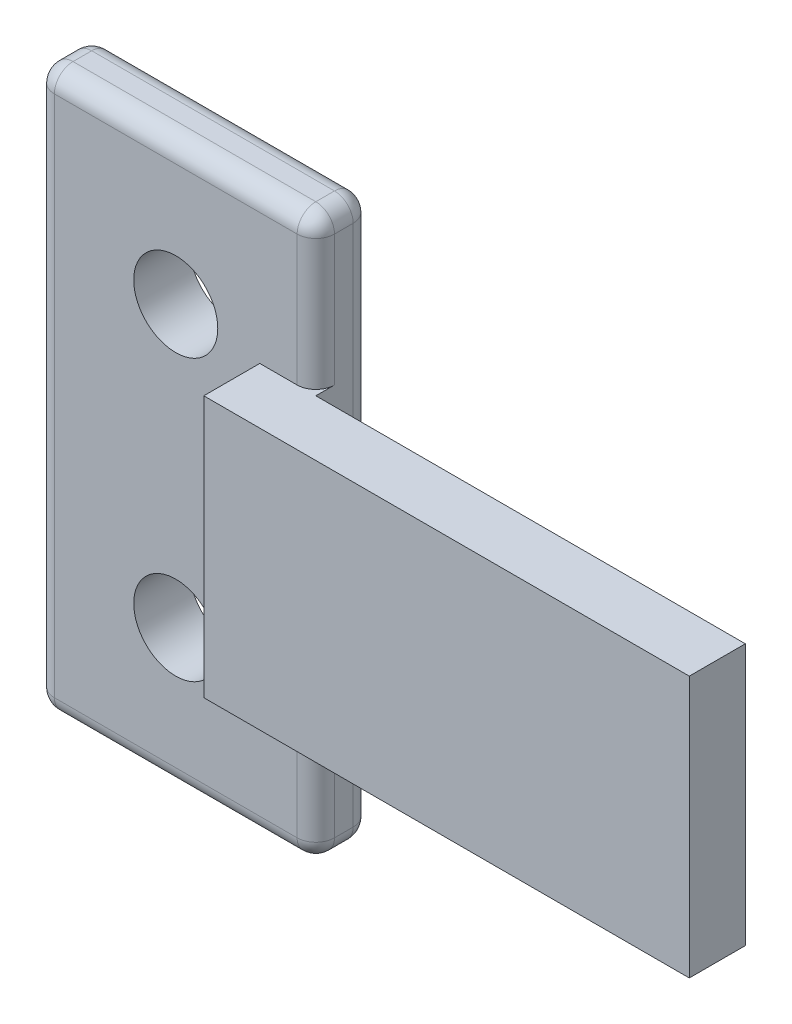
ISO-10303-21;
HEADER;
FILE_DESCRIPTION(('STEP AP214'),'2;1');
FILE_NAME('part.step','',(''),(''),'','','');
FILE_SCHEMA(('AUTOMOTIVE_DESIGN { 1 0 10303 214 1 1 1 1 }'));
ENDSEC;
DATA;
#1=APPLICATION_CONTEXT('core data for automotive mechanical design processes');
#2=APPLICATION_PROTOCOL_DEFINITION('international standard','automotive_design',2000,#1);
#3=PRODUCT_CONTEXT('',#1,'mechanical');
#4=PRODUCT('Part','Part','',(#3));
#5=PRODUCT_RELATED_PRODUCT_CATEGORY('part','',(#4));
#6=PRODUCT_DEFINITION_FORMATION('','',#4);
#7=PRODUCT_DEFINITION_CONTEXT('part definition',#1,'design');
#8=PRODUCT_DEFINITION('design','',#6,#7);
#9=PRODUCT_DEFINITION_SHAPE('','',#8);
#10=(LENGTH_UNIT() NAMED_UNIT(*) SI_UNIT(.MILLI.,.METRE.));
#11=(NAMED_UNIT(*) PLANE_ANGLE_UNIT() SI_UNIT($,.RADIAN.));
#12=(NAMED_UNIT(*) SI_UNIT($,.STERADIAN.) SOLID_ANGLE_UNIT());
#13=UNCERTAINTY_MEASURE_WITH_UNIT(LENGTH_MEASURE(1.E-05),#10,'distance_accuracy_value','');
#14=(GEOMETRIC_REPRESENTATION_CONTEXT(3) GLOBAL_UNCERTAINTY_ASSIGNED_CONTEXT((#13)) GLOBAL_UNIT_ASSIGNED_CONTEXT((#10,
#11,#12)) REPRESENTATION_CONTEXT('',''));
#15=CARTESIAN_POINT('',(0.,0.,0.));
#16=DIRECTION('',(0.,0.,1.));
#17=DIRECTION('',(1.,0.,0.));
#18=AXIS2_PLACEMENT_3D('',#15,#16,#17);
#19=CARTESIAN_POINT('',(0.,0.,3.));
#20=DIRECTION('',(0.,0.,1.));
#21=DIRECTION('',(1.,0.,0.));
#22=AXIS2_PLACEMENT_3D('',#19,#20,#21);
#23=PLANE('',#22);
#24=DIRECTION('',(1.,0.,0.));
#25=VECTOR('',#24,1.);
#26=CARTESIAN_POINT('',(12.,-7.99999999999995,3.));
#27=LINE('',#26,#25);
#28=CARTESIAN_POINT('',(12.,-7.99999999999995,3.));
#29=VERTEX_POINT('',#28);
#30=CARTESIAN_POINT('',(14.,-7.99999999999999,3.));
#31=VERTEX_POINT('',#30);
#32=EDGE_CURVE('E181',#29,#31,#27,.T.);
#33=ORIENTED_EDGE('',*,*,#32,.T.);
#34=DIRECTION('',(0.,1.,0.));
#35=VECTOR('',#34,1.);
#36=CARTESIAN_POINT('',(14.,0.,2.99999999999984));
#37=LINE('',#36,#35);
#38=CARTESIAN_POINT('',(13.9999999999999,-0.99999999999989,2.99999999999984));
#39=VERTEX_POINT('',#38);
#40=EDGE_CURVE('E244',#31,#39,#37,.T.);
#41=ORIENTED_EDGE('',*,*,#40,.T.);
#42=DIRECTION('',(-1.,0.,0.));
#43=VECTOR('',#42,1.);
#44=CARTESIAN_POINT('',(0.,-0.999999999999987,3.));
#45=LINE('',#44,#43);
#46=CARTESIAN_POINT('',(1.,-0.999999999999987,3.));
#47=VERTEX_POINT('',#46);
#48=EDGE_CURVE('E242',#39,#47,#45,.T.);
#49=ORIENTED_EDGE('',*,*,#48,.T.);
#50=DIRECTION('',(0.,-1.,0.));
#51=VECTOR('',#50,1.);
#52=CARTESIAN_POINT('',(0.999999999999945,-29.9999999999999,2.99999999999984));
#53=LINE('',#52,#51);
#54=CARTESIAN_POINT('',(1.,-29.,2.99999999999984));
#55=VERTEX_POINT('',#54);
#56=EDGE_CURVE('E240',#47,#55,#53,.T.);
#57=ORIENTED_EDGE('',*,*,#56,.T.);
#58=DIRECTION('',(1.,0.,0.));
#59=VECTOR('',#58,1.);
#60=CARTESIAN_POINT('',(15.,-28.9999999999999,2.99999999999998));
#61=LINE('',#60,#59);
#62=CARTESIAN_POINT('',(14.,-29.,2.99999999999998));
#63=VERTEX_POINT('',#62);
#64=EDGE_CURVE('E237',#55,#63,#61,.T.);
#65=ORIENTED_EDGE('',*,*,#64,.T.);
#66=DIRECTION('',(0.,1.,0.));
#67=VECTOR('',#66,1.);
#68=CARTESIAN_POINT('',(14.,-22.,3.));
#69=LINE('',#68,#67);
#70=CARTESIAN_POINT('',(14.,-22.,3.));
#71=VERTEX_POINT('',#70);
#72=EDGE_CURVE('E233',#63,#71,#69,.T.);
#73=ORIENTED_EDGE('',*,*,#72,.T.);
#74=DIRECTION('',(1.,0.,0.));
#75=VECTOR('',#74,1.);
#76=CARTESIAN_POINT('',(12.,-22.,3.));
#77=LINE('',#76,#75);
#78=CARTESIAN_POINT('',(12.,-22.,3.));
#79=VERTEX_POINT('',#78);
#80=EDGE_CURVE('E220',#79,#71,#77,.T.);
#81=ORIENTED_EDGE('',*,*,#80,.F.);
#82=DIRECTION('',(0.,-1.,0.));
#83=VECTOR('',#82,1.);
#84=CARTESIAN_POINT('',(12.,-22.,3.));
#85=LINE('',#84,#83);
#86=EDGE_CURVE('E209',#29,#79,#85,.T.);
#87=ORIENTED_EDGE('',*,*,#86,.F.);
#88=EDGE_LOOP('',(#33,#41,#49,#57,#65,#73,#81,#87));
#89=FACE_BOUND('',#88,.T.);
#90=CARTESIAN_POINT('',(7.50000000000001,-7.49999999999998,3.));
#91=DIRECTION('',(0.,0.,1.));
#92=DIRECTION('',(1.,0.,0.));
#93=AXIS2_PLACEMENT_3D('',#90,#91,#92);
#94=CIRCLE('',#93,2.24999999999999);
#95=CARTESIAN_POINT('',(9.74999999999999,-7.49999999999998,3.));
#96=VERTEX_POINT('',#95);
#97=EDGE_CURVE('E230',#96,#96,#94,.T.);
#98=ORIENTED_EDGE('',*,*,#97,.F.);
#99=EDGE_LOOP('',(#98));
#100=FACE_BOUND('',#99,.T.);
#101=CARTESIAN_POINT('',(7.49999999999995,-22.4999999999999,3.));
#102=DIRECTION('',(0.,0.,1.));
#103=DIRECTION('',(1.,0.,0.));
#104=AXIS2_PLACEMENT_3D('',#101,#102,#103);
#105=CIRCLE('',#104,2.24999999999999);
#106=CARTESIAN_POINT('',(9.74999999999994,-22.4999999999999,3.));
#107=VERTEX_POINT('',#106);
#108=EDGE_CURVE('E224',#107,#107,#105,.T.);
#109=ORIENTED_EDGE('',*,*,#108,.F.);
#110=EDGE_LOOP('',(#109));
#111=FACE_BOUND('',#110,.T.);
#112=ADVANCED_FACE('F36',(#89,#100,#111),#23,.T.);
#113=CARTESIAN_POINT('',(0.,0.,0.));
#114=DIRECTION('',(0.,0.,1.));
#115=DIRECTION('',(1.,0.,0.));
#116=AXIS2_PLACEMENT_3D('',#113,#114,#115);
#117=PLANE('',#116);
#118=DIRECTION('',(1.,0.,0.));
#119=VECTOR('',#118,1.);
#120=CARTESIAN_POINT('',(0.,-28.9999999999999,-1.66533453693773E-13));
#121=LINE('',#120,#119);
#122=CARTESIAN_POINT('',(14.,-29.,0.));
#123=VERTEX_POINT('',#122);
#124=CARTESIAN_POINT('',(1.,-29.,-1.66533453693773E-13));
#125=VERTEX_POINT('',#124);
#126=EDGE_CURVE('E273',#123,#125,#121,.F.);
#127=ORIENTED_EDGE('',*,*,#126,.T.);
#128=DIRECTION('',(0.,-1.,0.));
#129=VECTOR('',#128,1.);
#130=CARTESIAN_POINT('',(1.,0.,0.));
#131=LINE('',#130,#129);
#132=CARTESIAN_POINT('',(1.,-0.999999999999987,0.));
#133=VERTEX_POINT('',#132);
#134=EDGE_CURVE('E276',#125,#133,#131,.F.);
#135=ORIENTED_EDGE('',*,*,#134,.T.);
#136=DIRECTION('',(-1.,0.,0.));
#137=VECTOR('',#136,1.);
#138=CARTESIAN_POINT('',(0.,-0.999999999999945,0.));
#139=LINE('',#138,#137);
#140=CARTESIAN_POINT('',(13.9999999999999,-0.99999999999989,-1.66533453693773E-13));
#141=VERTEX_POINT('',#140);
#142=EDGE_CURVE('E271',#133,#141,#139,.F.);
#143=ORIENTED_EDGE('',*,*,#142,.T.);
#144=DIRECTION('',(0.,1.,0.));
#145=VECTOR('',#144,1.);
#146=CARTESIAN_POINT('',(14.,0.,-1.66533453693773E-13));
#147=LINE('',#146,#145);
#148=EDGE_CURVE('E269',#141,#123,#147,.F.);
#149=ORIENTED_EDGE('',*,*,#148,.T.);
#150=EDGE_LOOP('',(#127,#135,#143,#149));
#151=FACE_BOUND('',#150,.T.);
#152=CARTESIAN_POINT('',(7.49999999999992,-7.49999999999988,0.));
#153=DIRECTION('',(0.,0.,1.));
#154=DIRECTION('',(1.,0.,0.));
#155=AXIS2_PLACEMENT_3D('',#152,#153,#154);
#156=CIRCLE('',#155,2.24999999999999);
#157=CARTESIAN_POINT('',(9.74999999999991,-7.49999999999988,0.));
#158=VERTEX_POINT('',#157);
#159=EDGE_CURVE('E227',#158,#158,#156,.T.);
#160=ORIENTED_EDGE('',*,*,#159,.T.);
#161=EDGE_LOOP('',(#160));
#162=FACE_BOUND('',#161,.T.);
#163=CARTESIAN_POINT('',(7.49999999999995,-22.4999999999999,0.));
#164=DIRECTION('',(0.,0.,1.));
#165=DIRECTION('',(1.,0.,0.));
#166=AXIS2_PLACEMENT_3D('',#163,#164,#165);
#167=CIRCLE('',#166,2.24999999999999);
#168=CARTESIAN_POINT('',(9.74999999999994,-22.4999999999999,0.));
#169=VERTEX_POINT('',#168);
#170=EDGE_CURVE('E223',#169,#169,#167,.T.);
#171=ORIENTED_EDGE('',*,*,#170,.T.);
#172=EDGE_LOOP('',(#171));
#173=FACE_BOUND('',#172,.T.);
#174=ADVANCED_FACE('F397',(#151,#162,#173),#117,.F.);
#175=CARTESIAN_POINT('',(0.,-30.,2.99999999999984));
#176=DIRECTION('',(0.,1.,0.));
#177=DIRECTION('',(0.,0.,1.));
#178=AXIS2_PLACEMENT_3D('',#175,#176,#177);
#179=PLANE('',#178);
#180=DIRECTION('',(0.,0.,-1.));
#181=VECTOR('',#180,1.);
#182=CARTESIAN_POINT('',(14.,-30.,2.99999999999984));
#183=LINE('',#182,#181);
#184=CARTESIAN_POINT('',(14.,-30.,0.999999999999834));
#185=VERTEX_POINT('',#184);
#186=CARTESIAN_POINT('',(14.,-30.,1.99999999999984));
#187=VERTEX_POINT('',#186);
#188=EDGE_CURVE('E250',#185,#187,#183,.F.);
#189=ORIENTED_EDGE('',*,*,#188,.T.);
#190=DIRECTION('',(1.,0.,0.));
#191=VECTOR('',#190,1.);
#192=CARTESIAN_POINT('',(0.,-30.,1.99999999999984));
#193=LINE('',#192,#191);
#194=CARTESIAN_POINT('',(0.999999999999945,-29.9999999999999,1.99999999999984));
#195=VERTEX_POINT('',#194);
#196=EDGE_CURVE('E252',#187,#195,#193,.F.);
#197=ORIENTED_EDGE('',*,*,#196,.T.);
#198=DIRECTION('',(0.,0.,-1.));
#199=VECTOR('',#198,1.);
#200=CARTESIAN_POINT('',(0.999999999999945,-29.9999999999999,2.99999999999984));
#201=LINE('',#200,#199);
#202=CARTESIAN_POINT('',(0.999999999999945,-29.9999999999999,0.999999999999834));
#203=VERTEX_POINT('',#202);
#204=EDGE_CURVE('E246',#195,#203,#201,.T.);
#205=ORIENTED_EDGE('',*,*,#204,.T.);
#206=DIRECTION('',(1.,0.,0.));
#207=VECTOR('',#206,1.);
#208=CARTESIAN_POINT('',(0.,-30.,0.999999999999834));
#209=LINE('',#208,#207);
#210=EDGE_CURVE('E248',#203,#185,#209,.T.);
#211=ORIENTED_EDGE('',*,*,#210,.T.);
#212=EDGE_LOOP('',(#189,#197,#205,#211));
#213=FACE_BOUND('',#212,.T.);
#214=ADVANCED_FACE('F433',(#213),#179,.F.);
#215=CARTESIAN_POINT('',(15.,-30.,2.99999999999998));
#216=DIRECTION('',(-1.,0.,0.));
#217=DIRECTION('',(0.,-1.,0.));
#218=AXIS2_PLACEMENT_3D('',#215,#216,#217);
#219=PLANE('',#218);
#220=DIRECTION('',(0.,1.,0.));
#221=VECTOR('',#220,1.);
#222=CARTESIAN_POINT('',(15.,-7.99999999999999,2.));
#223=LINE('',#222,#221);
#224=CARTESIAN_POINT('',(15.,-1.,1.99999999999984));
#225=VERTEX_POINT('',#224);
#226=CARTESIAN_POINT('',(15.,-7.99999999999999,2.));
#227=VERTEX_POINT('',#226);
#228=EDGE_CURVE('E264',#225,#227,#223,.F.);
#229=ORIENTED_EDGE('',*,*,#228,.T.);
#230=DIRECTION('',(0.,0.,1.));
#231=VECTOR('',#230,1.);
#232=CARTESIAN_POINT('',(15.,-7.99999999999999,3.));
#233=LINE('',#232,#231);
#234=CARTESIAN_POINT('',(15.,-7.99999999999999,3.));
#235=VERTEX_POINT('',#234);
#236=EDGE_CURVE('E267',#227,#235,#233,.T.);
#237=ORIENTED_EDGE('',*,*,#236,.T.);
#238=DIRECTION('',(0.,-1.,0.));
#239=VECTOR('',#238,1.);
#240=CARTESIAN_POINT('',(15.,-30.,2.99999999999998));
#241=LINE('',#240,#239);
#242=CARTESIAN_POINT('',(15.,-21.9999999999999,3.));
#243=VERTEX_POINT('',#242);
#244=EDGE_CURVE('E206',#235,#243,#241,.T.);
#245=ORIENTED_EDGE('',*,*,#244,.T.);
#246=DIRECTION('',(0.,0.,-1.));
#247=VECTOR('',#246,1.);
#248=CARTESIAN_POINT('',(15.,-21.9999999999999,2.99999999999998));
#249=LINE('',#248,#247);
#250=CARTESIAN_POINT('',(15.,-21.9999999999999,2.));
#251=VERTEX_POINT('',#250);
#252=EDGE_CURVE('E52',#243,#251,#249,.T.);
#253=ORIENTED_EDGE('',*,*,#252,.T.);
#254=DIRECTION('',(0.,1.,0.));
#255=VECTOR('',#254,1.);
#256=CARTESIAN_POINT('',(15.,-30.,1.99999999999997));
#257=LINE('',#256,#255);
#258=CARTESIAN_POINT('',(15.,-28.9999999999999,1.99999999999997));
#259=VERTEX_POINT('',#258);
#260=EDGE_CURVE('E261',#251,#259,#257,.F.);
#261=ORIENTED_EDGE('',*,*,#260,.T.);
#262=DIRECTION('',(0.,0.,-1.));
#263=VECTOR('',#262,1.);
#264=CARTESIAN_POINT('',(15.,-28.9999999999999,2.99999999999998));
#265=LINE('',#264,#263);
#266=CARTESIAN_POINT('',(15.,-28.9999999999999,0.999999999999973));
#267=VERTEX_POINT('',#266);
#268=EDGE_CURVE('E259',#259,#267,#265,.T.);
#269=ORIENTED_EDGE('',*,*,#268,.T.);
#270=DIRECTION('',(0.,1.,0.));
#271=VECTOR('',#270,1.);
#272=CARTESIAN_POINT('',(15.,-30.,0.999999999999834));
#273=LINE('',#272,#271);
#274=CARTESIAN_POINT('',(15.,-1.,0.999999999999834));
#275=VERTEX_POINT('',#274);
#276=EDGE_CURVE('E255',#267,#275,#273,.T.);
#277=ORIENTED_EDGE('',*,*,#276,.T.);
#278=DIRECTION('',(0.,0.,-1.));
#279=VECTOR('',#278,1.);
#280=CARTESIAN_POINT('',(15.,-1.,2.99999999999984));
#281=LINE('',#280,#279);
#282=EDGE_CURVE('E257',#275,#225,#281,.F.);
#283=ORIENTED_EDGE('',*,*,#282,.T.);
#284=EDGE_LOOP('',(#229,#237,#245,#253,#261,#269,#277,#283));
#285=FACE_BOUND('',#284,.T.);
#286=ADVANCED_FACE('F382',(#285),#219,.F.);
#287=CARTESIAN_POINT('',(15.,0.,2.99999999999984));
#288=DIRECTION('',(0.,-1.,0.));
#289=DIRECTION('',(1.,0.,0.));
#290=AXIS2_PLACEMENT_3D('',#287,#288,#289);
#291=PLANE('',#290);
#292=DIRECTION('',(-1.,0.,0.));
#293=VECTOR('',#292,1.);
#294=CARTESIAN_POINT('',(15.,0.,1.99999999999984));
#295=LINE('',#294,#293);
#296=CARTESIAN_POINT('',(1.,0.,2.));
#297=VERTEX_POINT('',#296);
#298=CARTESIAN_POINT('',(14.,0.,1.99999999999984));
#299=VERTEX_POINT('',#298);
#300=EDGE_CURVE('E282',#297,#299,#295,.F.);
#301=ORIENTED_EDGE('',*,*,#300,.T.);
#302=DIRECTION('',(0.,0.,-1.));
#303=VECTOR('',#302,1.);
#304=CARTESIAN_POINT('',(14.,0.,2.99999999999984));
#305=LINE('',#304,#303);
#306=CARTESIAN_POINT('',(14.,0.,0.999999999999834));
#307=VERTEX_POINT('',#306);
#308=EDGE_CURVE('E284',#299,#307,#305,.T.);
#309=ORIENTED_EDGE('',*,*,#308,.T.);
#310=DIRECTION('',(-1.,0.,0.));
#311=VECTOR('',#310,1.);
#312=CARTESIAN_POINT('',(15.,0.,0.999999999999834));
#313=LINE('',#312,#311);
#314=CARTESIAN_POINT('',(1.,0.,1.));
#315=VERTEX_POINT('',#314);
#316=EDGE_CURVE('E280',#307,#315,#313,.T.);
#317=ORIENTED_EDGE('',*,*,#316,.T.);
#318=DIRECTION('',(0.,0.,-1.));
#319=VECTOR('',#318,1.);
#320=CARTESIAN_POINT('',(1.,0.,3.));
#321=LINE('',#320,#319);
#322=EDGE_CURVE('E278',#315,#297,#321,.F.);
#323=ORIENTED_EDGE('',*,*,#322,.T.);
#324=EDGE_LOOP('',(#301,#309,#317,#323));
#325=FACE_BOUND('',#324,.T.);
#326=ADVANCED_FACE('F423',(#325),#291,.F.);
#327=CARTESIAN_POINT('',(0.,-30.,2.99999999999984));
#328=DIRECTION('',(1.,0.,0.));
#329=DIRECTION('',(0.,1.,0.));
#330=AXIS2_PLACEMENT_3D('',#327,#328,#329);
#331=PLANE('',#330);
#332=DIRECTION('',(0.,-1.,0.));
#333=VECTOR('',#332,1.);
#334=CARTESIAN_POINT('',(0.,0.,2.));
#335=LINE('',#334,#333);
#336=CARTESIAN_POINT('',(0.,-28.9999999999999,1.99999999999984));
#337=VERTEX_POINT('',#336);
#338=CARTESIAN_POINT('',(0.,-0.999999999999987,2.));
#339=VERTEX_POINT('',#338);
#340=EDGE_CURVE('E60',#337,#339,#335,.F.);
#341=ORIENTED_EDGE('',*,*,#340,.T.);
#342=DIRECTION('',(0.,0.,-1.));
#343=VECTOR('',#342,1.);
#344=CARTESIAN_POINT('',(0.,-0.999999999999987,3.));
#345=LINE('',#344,#343);
#346=CARTESIAN_POINT('',(0.,-0.999999999999987,1.));
#347=VERTEX_POINT('',#346);
#348=EDGE_CURVE('E292',#339,#347,#345,.T.);
#349=ORIENTED_EDGE('',*,*,#348,.T.);
#350=DIRECTION('',(0.,-1.,0.));
#351=VECTOR('',#350,1.);
#352=CARTESIAN_POINT('',(0.,-30.,0.999999999999834));
#353=LINE('',#352,#351);
#354=CARTESIAN_POINT('',(0.,-28.9999999999999,0.999999999999834));
#355=VERTEX_POINT('',#354);
#356=EDGE_CURVE('E287',#347,#355,#353,.T.);
#357=ORIENTED_EDGE('',*,*,#356,.T.);
#358=DIRECTION('',(0.,0.,-1.));
#359=VECTOR('',#358,1.);
#360=CARTESIAN_POINT('',(0.,-28.9999999999999,2.99999999999984));
#361=LINE('',#360,#359);
#362=EDGE_CURVE('E289',#355,#337,#361,.F.);
#363=ORIENTED_EDGE('',*,*,#362,.T.);
#364=EDGE_LOOP('',(#341,#349,#357,#363));
#365=FACE_BOUND('',#364,.T.);
#366=ADVANCED_FACE('F425',(#365),#331,.F.);
#367=CARTESIAN_POINT('',(7.50000000000001,-7.49999999999998,3.));
#368=DIRECTION('',(0.,0.,-1.));
#369=DIRECTION('',(-1.,0.,0.));
#370=AXIS2_PLACEMENT_3D('',#367,#368,#369);
#371=CYLINDRICAL_SURFACE('',#370,2.24999999999999);
#372=ORIENTED_EDGE('',*,*,#97,.T.);
#373=EDGE_LOOP('',(#372));
#374=FACE_BOUND('',#373,.T.);
#375=ORIENTED_EDGE('',*,*,#159,.F.);
#376=EDGE_LOOP('',(#375));
#377=FACE_BOUND('',#376,.T.);
#378=ADVANCED_FACE('F431',(#374,#377),#371,.F.);
#379=CARTESIAN_POINT('',(7.49999999999995,-22.4999999999999,3.));
#380=DIRECTION('',(0.,0.,-1.));
#381=DIRECTION('',(-1.,0.,0.));
#382=AXIS2_PLACEMENT_3D('',#379,#380,#381);
#383=CYLINDRICAL_SURFACE('',#382,2.24999999999999);
#384=ORIENTED_EDGE('',*,*,#108,.T.);
#385=EDGE_LOOP('',(#384));
#386=FACE_BOUND('',#385,.T.);
#387=ORIENTED_EDGE('',*,*,#170,.F.);
#388=EDGE_LOOP('',(#387));
#389=FACE_BOUND('',#388,.T.);
#390=ADVANCED_FACE('F444',(#386,#389),#383,.F.);
#391=CARTESIAN_POINT('',(12.,-22.,6.00000000000001));
#392=DIRECTION('',(0.,1.,0.));
#393=DIRECTION('',(0.,0.,1.));
#394=AXIS2_PLACEMENT_3D('',#391,#392,#393);
#395=PLANE('',#394);
#396=ORIENTED_EDGE('',*,*,#80,.T.);
#397=CARTESIAN_POINT('',(14.,-22.,2.));
#398=DIRECTION('',(0.,1.,0.));
#399=DIRECTION('',(0.,0.,1.));
#400=AXIS2_PLACEMENT_3D('',#397,#398,#399);
#401=CIRCLE('',#400,1.);
#402=EDGE_CURVE('E11',#71,#251,#401,.T.);
#403=ORIENTED_EDGE('',*,*,#402,.T.);
#404=ORIENTED_EDGE('',*,*,#252,.F.);
#405=DIRECTION('',(-1.,0.,0.));
#406=VECTOR('',#405,1.);
#407=CARTESIAN_POINT('',(38.,-22.,3.));
#408=LINE('',#407,#406);
#409=CARTESIAN_POINT('',(38.,-22.,3.));
#410=VERTEX_POINT('',#409);
#411=EDGE_CURVE('E203',#410,#243,#408,.T.);
#412=ORIENTED_EDGE('',*,*,#411,.F.);
#413=DIRECTION('',(0.,0.,1.));
#414=VECTOR('',#413,1.);
#415=CARTESIAN_POINT('',(38.,-22.,6.00000000000001));
#416=LINE('',#415,#414);
#417=CARTESIAN_POINT('',(38.,-22.,6.00000000000001));
#418=VERTEX_POINT('',#417);
#419=EDGE_CURVE('E200',#410,#418,#416,.T.);
#420=ORIENTED_EDGE('',*,*,#419,.T.);
#421=DIRECTION('',(1.,0.,0.));
#422=VECTOR('',#421,1.);
#423=CARTESIAN_POINT('',(12.,-22.,6.00000000000001));
#424=LINE('',#423,#422);
#425=CARTESIAN_POINT('',(12.,-22.,6.00000000000001));
#426=VERTEX_POINT('',#425);
#427=EDGE_CURVE('E180',#426,#418,#424,.T.);
#428=ORIENTED_EDGE('',*,*,#427,.F.);
#429=DIRECTION('',(0.,0.,1.));
#430=VECTOR('',#429,1.);
#431=CARTESIAN_POINT('',(12.,-22.,6.00000000000001));
#432=LINE('',#431,#430);
#433=EDGE_CURVE('E212',#79,#426,#432,.T.);
#434=ORIENTED_EDGE('',*,*,#433,.F.);
#435=EDGE_LOOP('',(#396,#403,#404,#412,#420,#428,#434));
#436=FACE_BOUND('',#435,.T.);
#437=ADVANCED_FACE('F448',(#436),#395,.F.);
#438=CARTESIAN_POINT('',(12.,-7.99999999999995,6.00000000000001));
#439=DIRECTION('',(0.,0.,-1.));
#440=DIRECTION('',(0.,1.,0.));
#441=AXIS2_PLACEMENT_3D('',#438,#439,#440);
#442=PLANE('',#441);
#443=ORIENTED_EDGE('',*,*,#427,.T.);
#444=DIRECTION('',(0.,1.,0.));
#445=VECTOR('',#444,1.);
#446=CARTESIAN_POINT('',(38.,-22.,6.00000000000001));
#447=LINE('',#446,#445);
#448=CARTESIAN_POINT('',(38.,-7.99999999999998,5.99999999999984));
#449=VERTEX_POINT('',#448);
#450=EDGE_CURVE('E188',#418,#449,#447,.T.);
#451=ORIENTED_EDGE('',*,*,#450,.T.);
#452=DIRECTION('',(1.,0.,0.));
#453=VECTOR('',#452,1.);
#454=CARTESIAN_POINT('',(12.,-7.99999999999995,6.00000000000001));
#455=LINE('',#454,#453);
#456=CARTESIAN_POINT('',(12.,-7.99999999999995,6.00000000000001));
#457=VERTEX_POINT('',#456);
#458=EDGE_CURVE('E170',#457,#449,#455,.T.);
#459=ORIENTED_EDGE('',*,*,#458,.F.);
#460=DIRECTION('',(0.,1.,0.));
#461=VECTOR('',#460,1.);
#462=CARTESIAN_POINT('',(12.,-7.99999999999995,6.00000000000001));
#463=LINE('',#462,#461);
#464=EDGE_CURVE('E214',#426,#457,#463,.T.);
#465=ORIENTED_EDGE('',*,*,#464,.F.);
#466=EDGE_LOOP('',(#443,#451,#459,#465));
#467=FACE_BOUND('',#466,.T.);
#468=ADVANCED_FACE('F193',(#467),#442,.F.);
#469=CARTESIAN_POINT('',(12.,-7.99999999999995,3.));
#470=DIRECTION('',(0.,-1.,0.));
#471=DIRECTION('',(0.,0.,-1.));
#472=AXIS2_PLACEMENT_3D('',#469,#470,#471);
#473=PLANE('',#472);
#474=ORIENTED_EDGE('',*,*,#458,.T.);
#475=DIRECTION('',(0.,0.,-1.));
#476=VECTOR('',#475,1.);
#477=CARTESIAN_POINT('',(38.,-7.99999999999998,5.99999999999984));
#478=LINE('',#477,#476);
#479=CARTESIAN_POINT('',(38.,-7.99999999999998,2.99999999999984));
#480=VERTEX_POINT('',#479);
#481=EDGE_CURVE('E174',#449,#480,#478,.T.);
#482=ORIENTED_EDGE('',*,*,#481,.T.);
#483=DIRECTION('',(-1.,0.,0.));
#484=VECTOR('',#483,1.);
#485=CARTESIAN_POINT('',(38.,-7.99999999999998,2.99999999999984));
#486=LINE('',#485,#484);
#487=EDGE_CURVE('E202',#480,#235,#486,.T.);
#488=ORIENTED_EDGE('',*,*,#487,.T.);
#489=ORIENTED_EDGE('',*,*,#236,.F.);
#490=CARTESIAN_POINT('',(14.,-7.99999999999999,2.));
#491=DIRECTION('',(0.,-1.,0.));
#492=DIRECTION('',(0.,0.,-1.));
#493=AXIS2_PLACEMENT_3D('',#490,#491,#492);
#494=CIRCLE('',#493,1.);
#495=EDGE_CURVE('E45',#227,#31,#494,.T.);
#496=ORIENTED_EDGE('',*,*,#495,.T.);
#497=ORIENTED_EDGE('',*,*,#32,.F.);
#498=DIRECTION('',(0.,0.,-1.));
#499=VECTOR('',#498,1.);
#500=CARTESIAN_POINT('',(12.,-7.99999999999995,3.));
#501=LINE('',#500,#499);
#502=EDGE_CURVE('E176',#457,#29,#501,.T.);
#503=ORIENTED_EDGE('',*,*,#502,.F.);
#504=EDGE_LOOP('',(#474,#482,#488,#489,#496,#497,#503));
#505=FACE_BOUND('',#504,.T.);
#506=ADVANCED_FACE('F172',(#505),#473,.F.);
#507=CARTESIAN_POINT('',(12.,0.,-1.66533453693773E-13));
#508=DIRECTION('',(1.,0.,0.));
#509=DIRECTION('',(0.,0.,-1.));
#510=AXIS2_PLACEMENT_3D('',#507,#508,#509);
#511=PLANE('',#510);
#512=ORIENTED_EDGE('',*,*,#86,.T.);
#513=ORIENTED_EDGE('',*,*,#433,.T.);
#514=ORIENTED_EDGE('',*,*,#464,.T.);
#515=ORIENTED_EDGE('',*,*,#502,.T.);
#516=EDGE_LOOP('',(#512,#513,#514,#515));
#517=FACE_BOUND('',#516,.T.);
#518=ADVANCED_FACE('F456',(#517),#511,.F.);
#519=CARTESIAN_POINT('',(38.,-22.,3.));
#520=DIRECTION('',(0.,0.,-1.));
#521=DIRECTION('',(0.,1.,0.));
#522=AXIS2_PLACEMENT_3D('',#519,#520,#521);
#523=PLANE('',#522);
#524=ORIENTED_EDGE('',*,*,#244,.F.);
#525=ORIENTED_EDGE('',*,*,#487,.F.);
#526=DIRECTION('',(0.,-1.,0.));
#527=VECTOR('',#526,1.);
#528=CARTESIAN_POINT('',(38.,-22.,3.));
#529=LINE('',#528,#527);
#530=EDGE_CURVE('E191',#480,#410,#529,.T.);
#531=ORIENTED_EDGE('',*,*,#530,.T.);
#532=ORIENTED_EDGE('',*,*,#411,.T.);
#533=EDGE_LOOP('',(#524,#525,#531,#532));
#534=FACE_BOUND('',#533,.T.);
#535=ADVANCED_FACE('F459',(#534),#523,.T.);
#536=CARTESIAN_POINT('',(38.,0.,-1.66533453693773E-13));
#537=DIRECTION('',(-1.,0.,0.));
#538=DIRECTION('',(0.,0.,1.));
#539=AXIS2_PLACEMENT_3D('',#536,#537,#538);
#540=PLANE('',#539);
#541=ORIENTED_EDGE('',*,*,#450,.F.);
#542=ORIENTED_EDGE('',*,*,#419,.F.);
#543=ORIENTED_EDGE('',*,*,#530,.F.);
#544=ORIENTED_EDGE('',*,*,#481,.F.);
#545=EDGE_LOOP('',(#541,#542,#543,#544));
#546=FACE_BOUND('',#545,.T.);
#547=ADVANCED_FACE('F186',(#546),#540,.F.);
#548=CARTESIAN_POINT('',(14.,0.,1.99999999999984));
#549=DIRECTION('',(0.,-1.,0.));
#550=DIRECTION('',(1.,0.,0.));
#551=AXIS2_PLACEMENT_3D('',#548,#549,#550);
#552=CYLINDRICAL_SURFACE('',#551,1.);
#553=ORIENTED_EDGE('',*,*,#495,.F.);
#554=ORIENTED_EDGE('',*,*,#228,.F.);
#555=CARTESIAN_POINT('',(13.9999999999999,-0.99999999999989,1.99999999999984));
#556=DIRECTION('',(0.,1.,0.));
#557=DIRECTION('',(-1.,0.,0.));
#558=AXIS2_PLACEMENT_3D('',#555,#556,#557);
#559=CIRCLE('',#558,1.);
#560=EDGE_CURVE('E354',#39,#225,#559,.T.);
#561=ORIENTED_EDGE('',*,*,#560,.F.);
#562=ORIENTED_EDGE('',*,*,#40,.F.);
#563=EDGE_LOOP('',(#553,#554,#561,#562));
#564=FACE_BOUND('',#563,.T.);
#565=ADVANCED_FACE('F38',(#564),#552,.T.);
#566=CARTESIAN_POINT('',(13.9999999999999,-0.99999999999989,2.99999999999984));
#567=DIRECTION('',(0.,0.,-1.));
#568=DIRECTION('',(-1.,0.,0.));
#569=AXIS2_PLACEMENT_3D('',#566,#567,#568);
#570=CYLINDRICAL_SURFACE('',#569,1.);
#571=CARTESIAN_POINT('',(13.9999999999999,-0.99999999999989,0.999999999999834));
#572=DIRECTION('',(0.,0.,-1.));
#573=DIRECTION('',(-1.,0.,0.));
#574=AXIS2_PLACEMENT_3D('',#571,#572,#573);
#575=CIRCLE('',#574,1.);
#576=EDGE_CURVE('E351',#307,#275,#575,.T.);
#577=ORIENTED_EDGE('',*,*,#576,.F.);
#578=ORIENTED_EDGE('',*,*,#308,.F.);
#579=CARTESIAN_POINT('',(13.9999999999999,-0.99999999999989,1.99999999999984));
#580=DIRECTION('',(0.,0.,1.));
#581=DIRECTION('',(1.,0.,0.));
#582=AXIS2_PLACEMENT_3D('',#579,#580,#581);
#583=CIRCLE('',#582,1.);
#584=EDGE_CURVE('E197',#225,#299,#583,.T.);
#585=ORIENTED_EDGE('',*,*,#584,.F.);
#586=ORIENTED_EDGE('',*,*,#282,.F.);
#587=EDGE_LOOP('',(#577,#578,#585,#586));
#588=FACE_BOUND('',#587,.T.);
#589=ADVANCED_FACE('F385',(#588),#570,.T.);
#590=CARTESIAN_POINT('',(15.,-1.,0.999999999999834));
#591=DIRECTION('',(-1.,0.,0.));
#592=DIRECTION('',(0.,-1.,0.));
#593=AXIS2_PLACEMENT_3D('',#590,#591,#592);
#594=CYLINDRICAL_SURFACE('',#593,1.);
#595=CARTESIAN_POINT('',(1.,-0.999999999999987,1.));
#596=DIRECTION('',(-1.,0.,0.));
#597=DIRECTION('',(0.,-1.,0.));
#598=AXIS2_PLACEMENT_3D('',#595,#596,#597);
#599=CIRCLE('',#598,1.);
#600=EDGE_CURVE('E40',#315,#133,#599,.T.);
#601=ORIENTED_EDGE('',*,*,#600,.F.);
#602=ORIENTED_EDGE('',*,*,#316,.F.);
#603=CARTESIAN_POINT('',(13.9999999999999,-0.99999999999989,0.999999999999834));
#604=DIRECTION('',(1.,0.,0.));
#605=DIRECTION('',(0.,0.,-1.));
#606=AXIS2_PLACEMENT_3D('',#603,#604,#605);
#607=CIRCLE('',#606,1.);
#608=EDGE_CURVE('E349',#141,#307,#607,.T.);
#609=ORIENTED_EDGE('',*,*,#608,.F.);
#610=ORIENTED_EDGE('',*,*,#142,.F.);
#611=EDGE_LOOP('',(#601,#602,#609,#610));
#612=FACE_BOUND('',#611,.T.);
#613=ADVANCED_FACE('F415',(#612),#594,.T.);
#614=CARTESIAN_POINT('',(1.,-0.999999999999987,1.));
#615=DIRECTION('',(0.,0.,1.));
#616=DIRECTION('',(1.,0.,0.));
#617=AXIS2_PLACEMENT_3D('',#614,#615,#616);
#618=SPHERICAL_SURFACE('',#617,1.);
#619=CARTESIAN_POINT('',(1.,-0.999999999999987,1.));
#620=DIRECTION('',(0.,0.,-1.));
#621=DIRECTION('',(-1.,0.,0.));
#622=AXIS2_PLACEMENT_3D('',#619,#620,#621);
#623=CIRCLE('',#622,1.);
#624=EDGE_CURVE('E343',#315,#347,#623,.F.);
#625=ORIENTED_EDGE('',*,*,#624,.F.);
#626=ORIENTED_EDGE('',*,*,#600,.T.);
#627=CARTESIAN_POINT('',(1.,-0.999999999999987,1.));
#628=DIRECTION('',(0.,1.,0.));
#629=DIRECTION('',(-1.,0.,0.));
#630=AXIS2_PLACEMENT_3D('',#627,#628,#629);
#631=CIRCLE('',#630,1.);
#632=EDGE_CURVE('E346',#347,#133,#631,.F.);
#633=ORIENTED_EDGE('',*,*,#632,.F.);
#634=EDGE_LOOP('',(#625,#626,#633));
#635=FACE_BOUND('',#634,.T.);
#636=ADVANCED_FACE('F418',(#635),#618,.T.);
#637=CARTESIAN_POINT('',(13.9999999999999,-0.99999999999989,1.99999999999984));
#638=DIRECTION('',(0.,0.,1.));
#639=DIRECTION('',(1.,0.,0.));
#640=AXIS2_PLACEMENT_3D('',#637,#638,#639);
#641=SPHERICAL_SURFACE('',#640,1.);
#642=ORIENTED_EDGE('',*,*,#560,.T.);
#643=ORIENTED_EDGE('',*,*,#584,.T.);
#644=CARTESIAN_POINT('',(13.9999999999999,-0.99999999999989,1.99999999999984));
#645=DIRECTION('',(1.,0.,0.));
#646=DIRECTION('',(0.,0.,-1.));
#647=AXIS2_PLACEMENT_3D('',#644,#645,#646);
#648=CIRCLE('',#647,1.);
#649=EDGE_CURVE('E340',#39,#299,#648,.F.);
#650=ORIENTED_EDGE('',*,*,#649,.F.);
#651=EDGE_LOOP('',(#642,#643,#650));
#652=FACE_BOUND('',#651,.T.);
#653=ADVANCED_FACE('F360',(#652),#641,.T.);
#654=CARTESIAN_POINT('',(13.9999999999999,-0.99999999999989,0.999999999999834));
#655=DIRECTION('',(0.,0.,1.));
#656=DIRECTION('',(1.,0.,0.));
#657=AXIS2_PLACEMENT_3D('',#654,#655,#656);
#658=SPHERICAL_SURFACE('',#657,1.);
#659=ORIENTED_EDGE('',*,*,#608,.T.);
#660=ORIENTED_EDGE('',*,*,#576,.T.);
#661=CARTESIAN_POINT('',(13.9999999999999,-0.99999999999989,0.999999999999834));
#662=DIRECTION('',(0.,1.,0.));
#663=DIRECTION('',(-1.,0.,0.));
#664=AXIS2_PLACEMENT_3D('',#661,#662,#663);
#665=CIRCLE('',#664,1.);
#666=EDGE_CURVE('E337',#141,#275,#665,.F.);
#667=ORIENTED_EDGE('',*,*,#666,.F.);
#668=EDGE_LOOP('',(#659,#660,#667));
#669=FACE_BOUND('',#668,.T.);
#670=ADVANCED_FACE('F389',(#669),#658,.T.);
#671=CARTESIAN_POINT('',(0.999999999999945,-29.9999999999999,0.999999999999834));
#672=DIRECTION('',(0.,-1.,0.));
#673=DIRECTION('',(1.,0.,0.));
#674=AXIS2_PLACEMENT_3D('',#671,#672,#673);
#675=CYLINDRICAL_SURFACE('',#674,1.);
#676=ORIENTED_EDGE('',*,*,#632,.T.);
#677=ORIENTED_EDGE('',*,*,#134,.F.);
#678=CARTESIAN_POINT('',(1.,-29.,0.999999999999834));
#679=DIRECTION('',(0.,-1.,0.));
#680=DIRECTION('',(0.,0.,-1.));
#681=AXIS2_PLACEMENT_3D('',#678,#679,#680);
#682=CIRCLE('',#681,1.);
#683=EDGE_CURVE('E332',#355,#125,#682,.T.);
#684=ORIENTED_EDGE('',*,*,#683,.F.);
#685=ORIENTED_EDGE('',*,*,#356,.F.);
#686=EDGE_LOOP('',(#676,#677,#684,#685));
#687=FACE_BOUND('',#686,.T.);
#688=ADVANCED_FACE('F411',(#687),#675,.T.);
#689=CARTESIAN_POINT('',(1.,-0.999999999999987,3.));
#690=DIRECTION('',(0.,0.,-1.));
#691=DIRECTION('',(-1.,0.,0.));
#692=AXIS2_PLACEMENT_3D('',#689,#690,#691);
#693=CYLINDRICAL_SURFACE('',#692,1.);
#694=ORIENTED_EDGE('',*,*,#624,.T.);
#695=ORIENTED_EDGE('',*,*,#348,.F.);
#696=CARTESIAN_POINT('',(1.,-0.999999999999987,2.));
#697=DIRECTION('',(0.,0.,1.));
#698=DIRECTION('',(1.,0.,0.));
#699=AXIS2_PLACEMENT_3D('',#696,#697,#698);
#700=CIRCLE('',#699,1.);
#701=EDGE_CURVE('E329',#297,#339,#700,.T.);
#702=ORIENTED_EDGE('',*,*,#701,.F.);
#703=ORIENTED_EDGE('',*,*,#322,.F.);
#704=EDGE_LOOP('',(#694,#695,#702,#703));
#705=FACE_BOUND('',#704,.T.);
#706=ADVANCED_FACE('F421',(#705),#693,.T.);
#707=CARTESIAN_POINT('',(0.,-0.999999999999987,2.));
#708=DIRECTION('',(1.,0.,0.));
#709=DIRECTION('',(0.,1.,0.));
#710=AXIS2_PLACEMENT_3D('',#707,#708,#709);
#711=CYLINDRICAL_SURFACE('',#710,1.);
#712=ORIENTED_EDGE('',*,*,#649,.T.);
#713=ORIENTED_EDGE('',*,*,#300,.F.);
#714=CARTESIAN_POINT('',(1.,-0.999999999999987,2.));
#715=DIRECTION('',(-1.,0.,0.));
#716=DIRECTION('',(0.,-1.,0.));
#717=AXIS2_PLACEMENT_3D('',#714,#715,#716);
#718=CIRCLE('',#717,1.);
#719=EDGE_CURVE('E326',#47,#297,#718,.T.);
#720=ORIENTED_EDGE('',*,*,#719,.F.);
#721=ORIENTED_EDGE('',*,*,#48,.F.);
#722=EDGE_LOOP('',(#712,#713,#720,#721));
#723=FACE_BOUND('',#722,.T.);
#724=ADVANCED_FACE('F368',(#723),#711,.T.);
#725=CARTESIAN_POINT('',(14.,-30.,0.999999999999834));
#726=DIRECTION('',(0.,1.,0.));
#727=DIRECTION('',(-1.,0.,0.));
#728=AXIS2_PLACEMENT_3D('',#725,#726,#727);
#729=CYLINDRICAL_SURFACE('',#728,1.);
#730=ORIENTED_EDGE('',*,*,#666,.T.);
#731=ORIENTED_EDGE('',*,*,#276,.F.);
#732=CARTESIAN_POINT('',(14.,-29.,0.999999999999973));
#733=DIRECTION('',(0.,-1.,0.));
#734=DIRECTION('',(0.,0.,-1.));
#735=AXIS2_PLACEMENT_3D('',#732,#733,#734);
#736=CIRCLE('',#735,1.);
#737=EDGE_CURVE('E323',#123,#267,#736,.T.);
#738=ORIENTED_EDGE('',*,*,#737,.F.);
#739=ORIENTED_EDGE('',*,*,#148,.F.);
#740=EDGE_LOOP('',(#730,#731,#738,#739));
#741=FACE_BOUND('',#740,.T.);
#742=ADVANCED_FACE('F393',(#741),#729,.T.);
#743=CARTESIAN_POINT('',(0.,-28.9999999999999,0.999999999999834));
#744=DIRECTION('',(1.,0.,0.));
#745=DIRECTION('',(0.,0.,-1.));
#746=AXIS2_PLACEMENT_3D('',#743,#744,#745);
#747=CYLINDRICAL_SURFACE('',#746,1.);
#748=CARTESIAN_POINT('',(1.,-29.,0.999999999999834));
#749=DIRECTION('',(-1.,0.,0.));
#750=DIRECTION('',(0.,0.,1.));
#751=AXIS2_PLACEMENT_3D('',#748,#749,#750);
#752=CIRCLE('',#751,1.);
#753=EDGE_CURVE('E334',#125,#203,#752,.T.);
#754=ORIENTED_EDGE('',*,*,#753,.F.);
#755=ORIENTED_EDGE('',*,*,#126,.F.);
#756=CARTESIAN_POINT('',(14.,-29.,0.999999999999973));
#757=DIRECTION('',(1.,0.,0.));
#758=DIRECTION('',(0.,0.,-1.));
#759=AXIS2_PLACEMENT_3D('',#756,#757,#758);
#760=CIRCLE('',#759,1.);
#761=EDGE_CURVE('E320',#185,#123,#760,.T.);
#762=ORIENTED_EDGE('',*,*,#761,.F.);
#763=ORIENTED_EDGE('',*,*,#210,.F.);
#764=EDGE_LOOP('',(#754,#755,#762,#763));
#765=FACE_BOUND('',#764,.T.);
#766=ADVANCED_FACE('F403',(#765),#747,.T.);
#767=CARTESIAN_POINT('',(1.,-29.,0.999999999999834));
#768=DIRECTION('',(0.,0.,1.));
#769=DIRECTION('',(1.,0.,0.));
#770=AXIS2_PLACEMENT_3D('',#767,#768,#769);
#771=SPHERICAL_SURFACE('',#770,1.);
#772=ORIENTED_EDGE('',*,*,#683,.T.);
#773=ORIENTED_EDGE('',*,*,#753,.T.);
#774=CARTESIAN_POINT('',(1.,-29.,0.999999999999834));
#775=DIRECTION('',(0.,0.,-1.));
#776=DIRECTION('',(-1.,0.,0.));
#777=AXIS2_PLACEMENT_3D('',#774,#775,#776);
#778=CIRCLE('',#777,1.);
#779=EDGE_CURVE('E317',#355,#203,#778,.F.);
#780=ORIENTED_EDGE('',*,*,#779,.F.);
#781=EDGE_LOOP('',(#772,#773,#780));
#782=FACE_BOUND('',#781,.T.);
#783=ADVANCED_FACE('F492',(#782),#771,.T.);
#784=CARTESIAN_POINT('',(1.,-0.999999999999987,2.));
#785=DIRECTION('',(0.,0.,1.));
#786=DIRECTION('',(1.,0.,0.));
#787=AXIS2_PLACEMENT_3D('',#784,#785,#786);
#788=SPHERICAL_SURFACE('',#787,1.);
#789=ORIENTED_EDGE('',*,*,#719,.T.);
#790=ORIENTED_EDGE('',*,*,#701,.T.);
#791=CARTESIAN_POINT('',(1.,-0.999999999999987,2.));
#792=DIRECTION('',(0.,1.,0.));
#793=DIRECTION('',(0.,0.,1.));
#794=AXIS2_PLACEMENT_3D('',#791,#792,#793);
#795=CIRCLE('',#794,1.);
#796=EDGE_CURVE('E314',#47,#339,#795,.F.);
#797=ORIENTED_EDGE('',*,*,#796,.F.);
#798=EDGE_LOOP('',(#789,#790,#797));
#799=FACE_BOUND('',#798,.T.);
#800=ADVANCED_FACE('F495',(#799),#788,.T.);
#801=CARTESIAN_POINT('',(14.,-29.,0.999999999999973));
#802=DIRECTION('',(0.,0.,1.));
#803=DIRECTION('',(1.,0.,0.));
#804=AXIS2_PLACEMENT_3D('',#801,#802,#803);
#805=SPHERICAL_SURFACE('',#804,1.);
#806=ORIENTED_EDGE('',*,*,#761,.T.);
#807=ORIENTED_EDGE('',*,*,#737,.T.);
#808=CARTESIAN_POINT('',(14.,-29.,0.999999999999973));
#809=DIRECTION('',(0.,0.,-1.));
#810=DIRECTION('',(-1.,0.,0.));
#811=AXIS2_PLACEMENT_3D('',#808,#809,#810);
#812=CIRCLE('',#811,1.);
#813=EDGE_CURVE('E311',#185,#267,#812,.F.);
#814=ORIENTED_EDGE('',*,*,#813,.F.);
#815=EDGE_LOOP('',(#806,#807,#814));
#816=FACE_BOUND('',#815,.T.);
#817=ADVANCED_FACE('F498',(#816),#805,.T.);
#818=CARTESIAN_POINT('',(1.,-29.,2.99999999999984));
#819=DIRECTION('',(0.,0.,-1.));
#820=DIRECTION('',(-1.,0.,0.));
#821=AXIS2_PLACEMENT_3D('',#818,#819,#820);
#822=CYLINDRICAL_SURFACE('',#821,1.);
#823=ORIENTED_EDGE('',*,*,#779,.T.);
#824=ORIENTED_EDGE('',*,*,#204,.F.);
#825=CARTESIAN_POINT('',(1.,-29.,1.99999999999984));
#826=DIRECTION('',(0.,0.,1.));
#827=DIRECTION('',(1.,0.,0.));
#828=AXIS2_PLACEMENT_3D('',#825,#826,#827);
#829=CIRCLE('',#828,1.);
#830=EDGE_CURVE('E308',#337,#195,#829,.T.);
#831=ORIENTED_EDGE('',*,*,#830,.F.);
#832=ORIENTED_EDGE('',*,*,#362,.F.);
#833=EDGE_LOOP('',(#823,#824,#831,#832));
#834=FACE_BOUND('',#833,.T.);
#835=ADVANCED_FACE('F502',(#834),#822,.T.);
#836=CARTESIAN_POINT('',(1.,0.,2.));
#837=DIRECTION('',(0.,1.,0.));
#838=DIRECTION('',(-1.,0.,0.));
#839=AXIS2_PLACEMENT_3D('',#836,#837,#838);
#840=CYLINDRICAL_SURFACE('',#839,1.);
#841=ORIENTED_EDGE('',*,*,#796,.T.);
#842=ORIENTED_EDGE('',*,*,#340,.F.);
#843=CARTESIAN_POINT('',(1.,-29.,1.99999999999984));
#844=DIRECTION('',(0.,-1.,0.));
#845=DIRECTION('',(0.,0.,-1.));
#846=AXIS2_PLACEMENT_3D('',#843,#844,#845);
#847=CIRCLE('',#846,1.);
#848=EDGE_CURVE('E305',#55,#337,#847,.T.);
#849=ORIENTED_EDGE('',*,*,#848,.F.);
#850=ORIENTED_EDGE('',*,*,#56,.F.);
#851=EDGE_LOOP('',(#841,#842,#849,#850));
#852=FACE_BOUND('',#851,.T.);
#853=ADVANCED_FACE('F506',(#852),#840,.T.);
#854=CARTESIAN_POINT('',(14.,0.,1.99999999999984));
#855=DIRECTION('',(0.,-1.,0.));
#856=DIRECTION('',(1.,0.,0.));
#857=AXIS2_PLACEMENT_3D('',#854,#855,#856);
#858=CYLINDRICAL_SURFACE('',#857,1.);
#859=ORIENTED_EDGE('',*,*,#402,.F.);
#860=ORIENTED_EDGE('',*,*,#72,.F.);
#861=CARTESIAN_POINT('',(14.,-29.,1.99999999999997));
#862=DIRECTION('',(0.,-1.,0.));
#863=DIRECTION('',(0.,0.,-1.));
#864=AXIS2_PLACEMENT_3D('',#861,#862,#863);
#865=CIRCLE('',#864,1.);
#866=EDGE_CURVE('E302',#259,#63,#865,.T.);
#867=ORIENTED_EDGE('',*,*,#866,.F.);
#868=ORIENTED_EDGE('',*,*,#260,.F.);
#869=EDGE_LOOP('',(#859,#860,#867,#868));
#870=FACE_BOUND('',#869,.T.);
#871=ADVANCED_FACE('F510',(#870),#858,.T.);
#872=CARTESIAN_POINT('',(14.,-29.,2.99999999999998));
#873=DIRECTION('',(0.,0.,-1.));
#874=DIRECTION('',(-1.,0.,0.));
#875=AXIS2_PLACEMENT_3D('',#872,#873,#874);
#876=CYLINDRICAL_SURFACE('',#875,1.);
#877=ORIENTED_EDGE('',*,*,#813,.T.);
#878=ORIENTED_EDGE('',*,*,#268,.F.);
#879=CARTESIAN_POINT('',(14.,-29.,1.99999999999997));
#880=DIRECTION('',(0.,0.,1.));
#881=DIRECTION('',(1.,0.,0.));
#882=AXIS2_PLACEMENT_3D('',#879,#880,#881);
#883=CIRCLE('',#882,1.);
#884=EDGE_CURVE('E299',#187,#259,#883,.T.);
#885=ORIENTED_EDGE('',*,*,#884,.F.);
#886=ORIENTED_EDGE('',*,*,#188,.F.);
#887=EDGE_LOOP('',(#877,#878,#885,#886));
#888=FACE_BOUND('',#887,.T.);
#889=ADVANCED_FACE('F514',(#888),#876,.T.);
#890=CARTESIAN_POINT('',(1.,-29.,1.99999999999984));
#891=DIRECTION('',(0.,0.,1.));
#892=DIRECTION('',(1.,0.,0.));
#893=AXIS2_PLACEMENT_3D('',#890,#891,#892);
#894=SPHERICAL_SURFACE('',#893,1.);
#895=ORIENTED_EDGE('',*,*,#848,.T.);
#896=ORIENTED_EDGE('',*,*,#830,.T.);
#897=CARTESIAN_POINT('',(1.,-29.,1.99999999999984));
#898=DIRECTION('',(-1.,0.,0.));
#899=DIRECTION('',(0.,0.,1.));
#900=AXIS2_PLACEMENT_3D('',#897,#898,#899);
#901=CIRCLE('',#900,1.);
#902=EDGE_CURVE('E297',#55,#195,#901,.F.);
#903=ORIENTED_EDGE('',*,*,#902,.F.);
#904=EDGE_LOOP('',(#895,#896,#903));
#905=FACE_BOUND('',#904,.T.);
#906=ADVANCED_FACE('F518',(#905),#894,.T.);
#907=CARTESIAN_POINT('',(14.,-29.,1.99999999999997));
#908=DIRECTION('',(0.,0.,1.));
#909=DIRECTION('',(1.,0.,0.));
#910=AXIS2_PLACEMENT_3D('',#907,#908,#909);
#911=SPHERICAL_SURFACE('',#910,1.);
#912=ORIENTED_EDGE('',*,*,#884,.T.);
#913=ORIENTED_EDGE('',*,*,#866,.T.);
#914=CARTESIAN_POINT('',(14.,-29.,1.99999999999997));
#915=DIRECTION('',(1.,0.,0.));
#916=DIRECTION('',(0.,1.,0.));
#917=AXIS2_PLACEMENT_3D('',#914,#915,#916);
#918=CIRCLE('',#917,1.);
#919=EDGE_CURVE('E295',#187,#63,#918,.F.);
#920=ORIENTED_EDGE('',*,*,#919,.F.);
#921=EDGE_LOOP('',(#912,#913,#920));
#922=FACE_BOUND('',#921,.T.);
#923=ADVANCED_FACE('F522',(#922),#911,.T.);
#924=CARTESIAN_POINT('',(0.,-28.9999999999999,1.99999999999984));
#925=DIRECTION('',(-1.,0.,0.));
#926=DIRECTION('',(0.,0.,1.));
#927=AXIS2_PLACEMENT_3D('',#924,#925,#926);
#928=CYLINDRICAL_SURFACE('',#927,1.);
#929=ORIENTED_EDGE('',*,*,#902,.T.);
#930=ORIENTED_EDGE('',*,*,#196,.F.);
#931=ORIENTED_EDGE('',*,*,#919,.T.);
#932=ORIENTED_EDGE('',*,*,#64,.F.);
#933=EDGE_LOOP('',(#929,#930,#931,#932));
#934=FACE_BOUND('',#933,.T.);
#935=ADVANCED_FACE('F526',(#934),#928,.T.);
#936=CLOSED_SHELL('',(#112,#174,#214,#286,#326,#366,#378,#390,#437,#468,#506,#518,#535,#547,
#565,#589,#613,#636,#653,#670,#688,#706,#724,#742,#766,#783,#800,#817,#835,#853,#871,#889,#906,
#923,#935));
#937=MANIFOLD_SOLID_BREP('B2',#936);
#938=ADVANCED_BREP_SHAPE_REPRESENTATION('',(#18,#937),#14);
#939=SHAPE_DEFINITION_REPRESENTATION(#9,#938);
ENDSEC;
END-ISO-10303-21;
